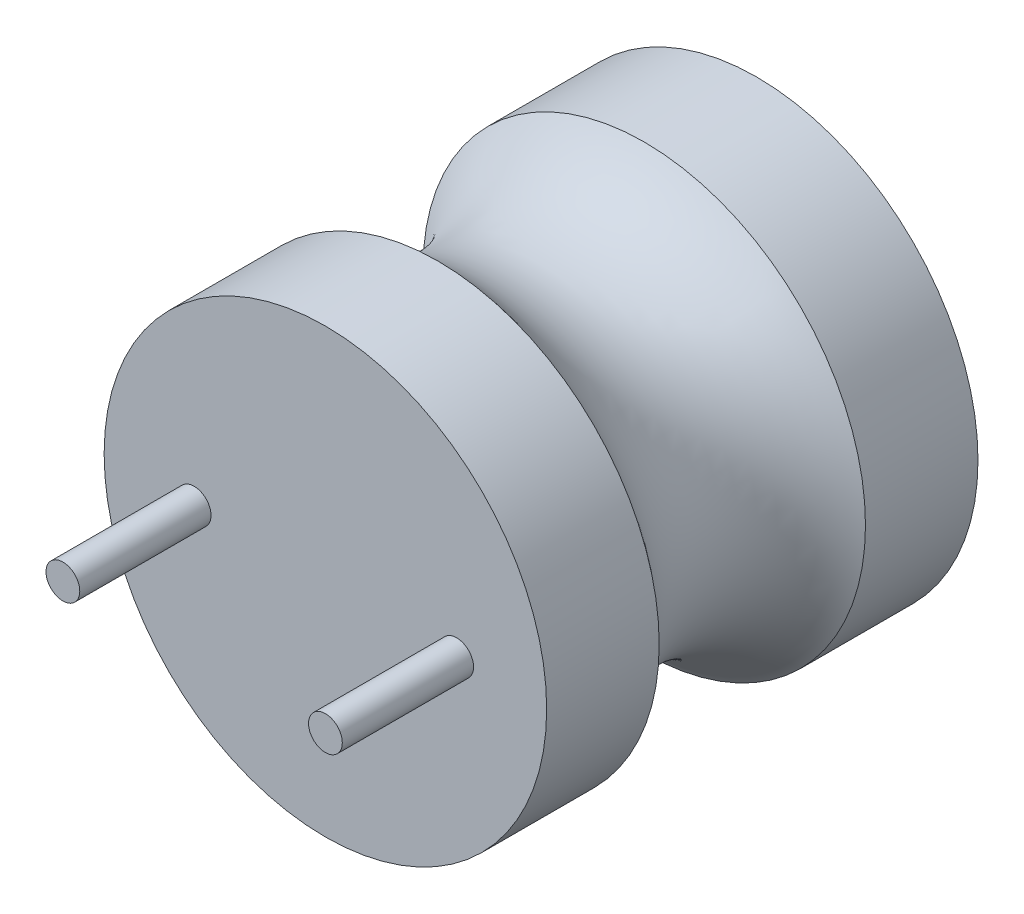
ISO-10303-21;
HEADER;
FILE_DESCRIPTION(('STEP AP214'),'2;1');
FILE_NAME('part.step','',(''),(''),'','','');
FILE_SCHEMA(('AUTOMOTIVE_DESIGN { 1 0 10303 214 1 1 1 1 }'));
ENDSEC;
DATA;
#1=APPLICATION_CONTEXT('core data for automotive mechanical design processes');
#2=APPLICATION_PROTOCOL_DEFINITION('international standard','automotive_design',2000,#1);
#3=PRODUCT_CONTEXT('',#1,'mechanical');
#4=PRODUCT('Part','Part','',(#3));
#5=PRODUCT_RELATED_PRODUCT_CATEGORY('part','',(#4));
#6=PRODUCT_DEFINITION_FORMATION('','',#4);
#7=PRODUCT_DEFINITION_CONTEXT('part definition',#1,'design');
#8=PRODUCT_DEFINITION('design','',#6,#7);
#9=PRODUCT_DEFINITION_SHAPE('','',#8);
#10=(LENGTH_UNIT() NAMED_UNIT(*) SI_UNIT(.MILLI.,.METRE.));
#11=(NAMED_UNIT(*) PLANE_ANGLE_UNIT() SI_UNIT($,.RADIAN.));
#12=(NAMED_UNIT(*) SI_UNIT($,.STERADIAN.) SOLID_ANGLE_UNIT());
#13=UNCERTAINTY_MEASURE_WITH_UNIT(LENGTH_MEASURE(1.E-05),#10,'distance_accuracy_value','');
#14=(GEOMETRIC_REPRESENTATION_CONTEXT(3) GLOBAL_UNCERTAINTY_ASSIGNED_CONTEXT((#13)) GLOBAL_UNIT_ASSIGNED_CONTEXT((#10,
#11,#12)) REPRESENTATION_CONTEXT('',''));
#15=CARTESIAN_POINT('',(0.,0.,0.));
#16=DIRECTION('',(0.,0.,1.));
#17=DIRECTION('',(1.,0.,0.));
#18=AXIS2_PLACEMENT_3D('',#15,#16,#17);
#19=CARTESIAN_POINT('',(0.,0.,0.));
#20=DIRECTION('',(0.,0.,-1.));
#21=DIRECTION('',(-1.,0.,0.));
#22=AXIS2_PLACEMENT_3D('',#19,#20,#21);
#23=PLANE('',#22);
#24=CARTESIAN_POINT('',(3.5,0.,0.));
#25=DIRECTION('',(0.,0.,-1.));
#26=DIRECTION('',(-1.,0.,0.));
#27=AXIS2_PLACEMENT_3D('',#24,#25,#26);
#28=CIRCLE('',#27,0.450000000000001);
#29=CARTESIAN_POINT('',(3.05,0.,0.));
#30=VERTEX_POINT('',#29);
#31=EDGE_CURVE('E10',#30,#30,#28,.F.);
#32=ORIENTED_EDGE('',*,*,#31,.F.);
#33=EDGE_LOOP('',(#32));
#34=FACE_BOUND('',#33,.T.);
#35=CARTESIAN_POINT('',(-3.5,0.,0.));
#36=DIRECTION('',(0.,0.,-1.));
#37=DIRECTION('',(-1.,0.,0.));
#38=AXIS2_PLACEMENT_3D('',#35,#36,#37);
#39=CIRCLE('',#38,0.45);
#40=CARTESIAN_POINT('',(-3.95,0.,0.));
#41=VERTEX_POINT('',#40);
#42=EDGE_CURVE('E37',#41,#41,#39,.F.);
#43=ORIENTED_EDGE('',*,*,#42,.F.);
#44=EDGE_LOOP('',(#43));
#45=FACE_BOUND('',#44,.T.);
#46=CARTESIAN_POINT('',(0.,0.,0.));
#47=DIRECTION('',(0.,0.,1.));
#48=DIRECTION('',(1.,0.,0.));
#49=AXIS2_PLACEMENT_3D('',#46,#47,#48);
#50=CIRCLE('',#49,5.9);
#51=CARTESIAN_POINT('',(5.9,0.,0.));
#52=VERTEX_POINT('',#51);
#53=EDGE_CURVE('E53',#52,#52,#50,.T.);
#54=ORIENTED_EDGE('',*,*,#53,.T.);
#55=EDGE_LOOP('',(#54));
#56=FACE_BOUND('',#55,.T.);
#57=ADVANCED_FACE('F31',(#34,#45,#56),#23,.F.);
#58=CARTESIAN_POINT('',(0.,0.,-11.5));
#59=DIRECTION('',(0.,0.,1.));
#60=DIRECTION('',(1.,0.,0.));
#61=AXIS2_PLACEMENT_3D('',#58,#59,#60);
#62=PLANE('',#61);
#63=CARTESIAN_POINT('',(0.,0.,-11.5));
#64=DIRECTION('',(0.,0.,1.));
#65=DIRECTION('',(1.,0.,0.));
#66=AXIS2_PLACEMENT_3D('',#63,#64,#65);
#67=CIRCLE('',#66,5.9);
#68=CARTESIAN_POINT('',(5.9,0.,-11.5));
#69=VERTEX_POINT('',#68);
#70=EDGE_CURVE('E41',#69,#69,#67,.T.);
#71=ORIENTED_EDGE('',*,*,#70,.F.);
#72=EDGE_LOOP('',(#71));
#73=FACE_BOUND('',#72,.T.);
#74=ADVANCED_FACE('F78',(#73),#62,.F.);
#75=CARTESIAN_POINT('',(0.,0.,0.));
#76=DIRECTION('',(0.,0.,1.));
#77=DIRECTION('',(1.,0.,0.));
#78=AXIS2_PLACEMENT_3D('',#75,#76,#77);
#79=CYLINDRICAL_SURFACE('',#78,5.9);
#80=CARTESIAN_POINT('',(0.,0.,-8.5));
#81=DIRECTION('',(0.,0.,1.));
#82=DIRECTION('',(1.,0.,0.));
#83=AXIS2_PLACEMENT_3D('',#80,#81,#82);
#84=CIRCLE('',#83,5.9);
#85=CARTESIAN_POINT('',(5.9,0.,-8.5));
#86=VERTEX_POINT('',#85);
#87=EDGE_CURVE('E45',#86,#86,#84,.T.);
#88=ORIENTED_EDGE('',*,*,#87,.F.);
#89=EDGE_LOOP('',(#88));
#90=FACE_BOUND('',#89,.T.);
#91=ORIENTED_EDGE('',*,*,#70,.T.);
#92=EDGE_LOOP('',(#91));
#93=FACE_BOUND('',#92,.T.);
#94=ADVANCED_FACE('F83',(#90,#93),#79,.T.);
#95=CARTESIAN_POINT('',(0.,0.,-5.75));
#96=DIRECTION('',(0.,0.,1.));
#97=DIRECTION('',(1.,0.,0.));
#98=AXIS2_PLACEMENT_3D('',#95,#96,#97);
#99=TOROIDAL_SURFACE('',#98,7.90089285714285,3.40089285714285);
#100=CARTESIAN_POINT('',(0.,0.,-3.));
#101=DIRECTION('',(0.,0.,1.));
#102=DIRECTION('',(1.,0.,0.));
#103=AXIS2_PLACEMENT_3D('',#100,#101,#102);
#104=CIRCLE('',#103,5.9);
#105=CARTESIAN_POINT('',(5.9,0.,-3.));
#106=VERTEX_POINT('',#105);
#107=EDGE_CURVE('E50',#106,#106,#104,.T.);
#108=ORIENTED_EDGE('',*,*,#107,.F.);
#109=EDGE_LOOP('',(#108));
#110=FACE_BOUND('',#109,.T.);
#111=ORIENTED_EDGE('',*,*,#87,.T.);
#112=EDGE_LOOP('',(#111));
#113=FACE_BOUND('',#112,.T.);
#114=ADVANCED_FACE('F92',(#110,#113),#99,.F.);
#115=CARTESIAN_POINT('',(0.,0.,0.));
#116=DIRECTION('',(0.,0.,1.));
#117=DIRECTION('',(1.,0.,0.));
#118=AXIS2_PLACEMENT_3D('',#115,#116,#117);
#119=CYLINDRICAL_SURFACE('',#118,5.9);
#120=ORIENTED_EDGE('',*,*,#53,.F.);
#121=EDGE_LOOP('',(#120));
#122=FACE_BOUND('',#121,.T.);
#123=ORIENTED_EDGE('',*,*,#107,.T.);
#124=EDGE_LOOP('',(#123));
#125=FACE_BOUND('',#124,.T.);
#126=ADVANCED_FACE('F89',(#122,#125),#119,.T.);
#127=CARTESIAN_POINT('',(-3.5,0.,3.5));
#128=DIRECTION('',(0.,0.,-1.));
#129=DIRECTION('',(-1.,0.,0.));
#130=AXIS2_PLACEMENT_3D('',#127,#128,#129);
#131=CYLINDRICAL_SURFACE('',#130,0.45);
#132=CARTESIAN_POINT('',(-3.5,0.,3.5));
#133=DIRECTION('',(0.,0.,1.));
#134=DIRECTION('',(1.,0.,0.));
#135=AXIS2_PLACEMENT_3D('',#132,#133,#134);
#136=CIRCLE('',#135,0.45);
#137=CARTESIAN_POINT('',(-3.05,0.,3.5));
#138=VERTEX_POINT('',#137);
#139=EDGE_CURVE('E56',#138,#138,#136,.T.);
#140=ORIENTED_EDGE('',*,*,#139,.F.);
#141=EDGE_LOOP('',(#140));
#142=FACE_BOUND('',#141,.T.);
#143=ORIENTED_EDGE('',*,*,#42,.T.);
#144=EDGE_LOOP('',(#143));
#145=FACE_BOUND('',#144,.T.);
#146=ADVANCED_FACE('F74',(#142,#145),#131,.T.);
#147=CARTESIAN_POINT('',(-3.5,0.,3.5));
#148=DIRECTION('',(0.,0.,1.));
#149=DIRECTION('',(1.,0.,0.));
#150=AXIS2_PLACEMENT_3D('',#147,#148,#149);
#151=PLANE('',#150);
#152=ORIENTED_EDGE('',*,*,#139,.T.);
#153=EDGE_LOOP('',(#152));
#154=FACE_BOUND('',#153,.T.);
#155=ADVANCED_FACE('F67',(#154),#151,.T.);
#156=CARTESIAN_POINT('',(3.5,0.,3.5));
#157=DIRECTION('',(0.,0.,-1.));
#158=DIRECTION('',(-1.,0.,0.));
#159=AXIS2_PLACEMENT_3D('',#156,#157,#158);
#160=CYLINDRICAL_SURFACE('',#159,0.450000000000001);
#161=CARTESIAN_POINT('',(3.5,0.,3.5));
#162=DIRECTION('',(0.,0.,1.));
#163=DIRECTION('',(1.,0.,0.));
#164=AXIS2_PLACEMENT_3D('',#161,#162,#163);
#165=CIRCLE('',#164,0.450000000000001);
#166=CARTESIAN_POINT('',(3.95,0.,3.5));
#167=VERTEX_POINT('',#166);
#168=EDGE_CURVE('E59',#167,#167,#165,.T.);
#169=ORIENTED_EDGE('',*,*,#168,.F.);
#170=EDGE_LOOP('',(#169));
#171=FACE_BOUND('',#170,.T.);
#172=ORIENTED_EDGE('',*,*,#31,.T.);
#173=EDGE_LOOP('',(#172));
#174=FACE_BOUND('',#173,.T.);
#175=ADVANCED_FACE('F65',(#171,#174),#160,.T.);
#176=CARTESIAN_POINT('',(3.5,0.,3.5));
#177=DIRECTION('',(0.,0.,1.));
#178=DIRECTION('',(1.,0.,0.));
#179=AXIS2_PLACEMENT_3D('',#176,#177,#178);
#180=PLANE('',#179);
#181=ORIENTED_EDGE('',*,*,#168,.T.);
#182=EDGE_LOOP('',(#181));
#183=FACE_BOUND('',#182,.T.);
#184=ADVANCED_FACE('F63',(#183),#180,.T.);
#185=CLOSED_SHELL('',(#57,#74,#94,#114,#126,#146,#155,#175,#184));
#186=MANIFOLD_SOLID_BREP('B2',#185);
#187=ADVANCED_BREP_SHAPE_REPRESENTATION('',(#18,#186),#14);
#188=SHAPE_DEFINITION_REPRESENTATION(#9,#187);
ENDSEC;
END-ISO-10303-21;
